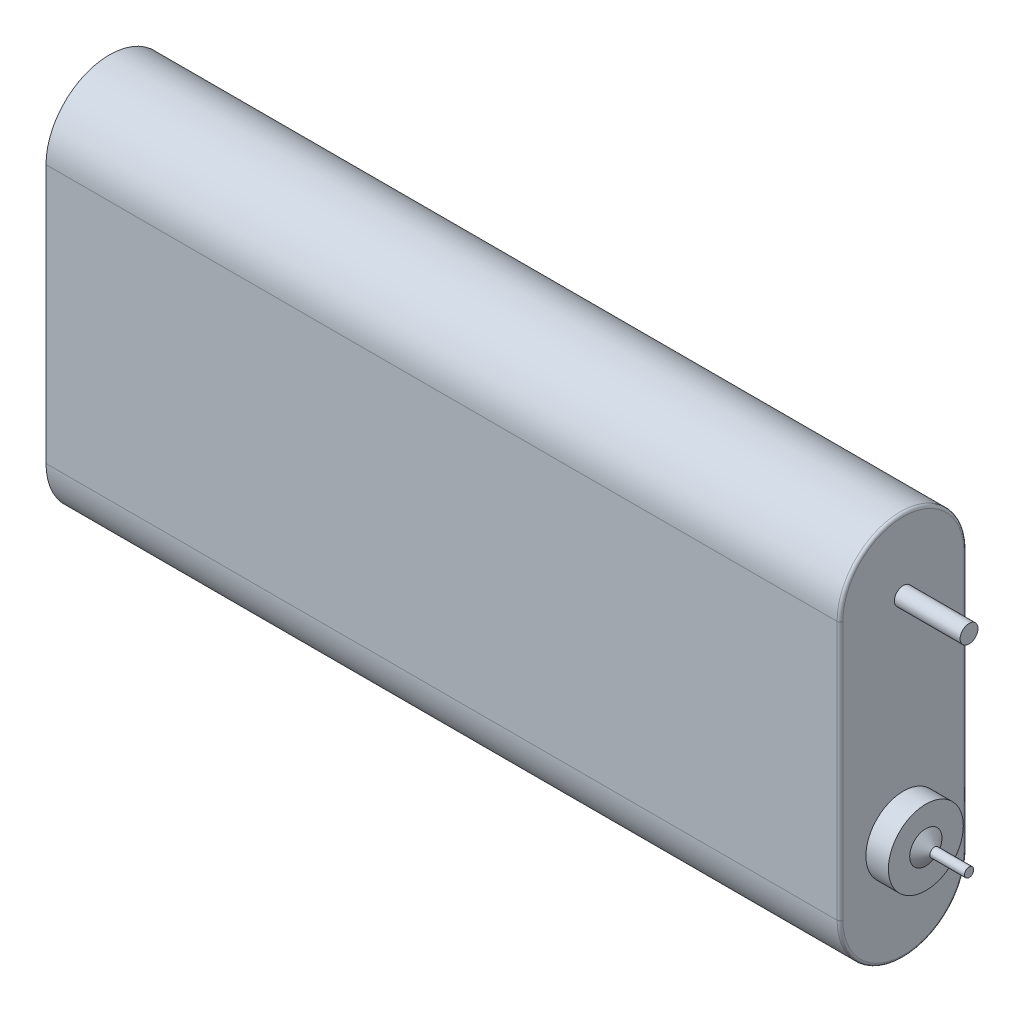
ISO-10303-21;
HEADER;
FILE_DESCRIPTION(('STEP AP214'),'2;1');
FILE_NAME('part.step','',(''),(''),'','','');
FILE_SCHEMA(('AUTOMOTIVE_DESIGN { 1 0 10303 214 1 1 1 1 }'));
ENDSEC;
DATA;
#1=APPLICATION_CONTEXT('core data for automotive mechanical design processes');
#2=APPLICATION_PROTOCOL_DEFINITION('international standard','automotive_design',2000,#1);
#3=PRODUCT_CONTEXT('',#1,'mechanical');
#4=PRODUCT('Part','Part','',(#3));
#5=PRODUCT_RELATED_PRODUCT_CATEGORY('part','',(#4));
#6=PRODUCT_DEFINITION_FORMATION('','',#4);
#7=PRODUCT_DEFINITION_CONTEXT('part definition',#1,'design');
#8=PRODUCT_DEFINITION('design','',#6,#7);
#9=PRODUCT_DEFINITION_SHAPE('','',#8);
#10=(LENGTH_UNIT() NAMED_UNIT(*) SI_UNIT(.MILLI.,.METRE.));
#11=(NAMED_UNIT(*) PLANE_ANGLE_UNIT() SI_UNIT($,.RADIAN.));
#12=(NAMED_UNIT(*) SI_UNIT($,.STERADIAN.) SOLID_ANGLE_UNIT());
#13=UNCERTAINTY_MEASURE_WITH_UNIT(LENGTH_MEASURE(1.E-05),#10,'distance_accuracy_value','');
#14=(GEOMETRIC_REPRESENTATION_CONTEXT(3) GLOBAL_UNCERTAINTY_ASSIGNED_CONTEXT((#13)) GLOBAL_UNIT_ASSIGNED_CONTEXT((#10,
#11,#12)) REPRESENTATION_CONTEXT('',''));
#15=CARTESIAN_POINT('',(0.,0.,0.));
#16=DIRECTION('',(0.,0.,1.));
#17=DIRECTION('',(1.,0.,0.));
#18=AXIS2_PLACEMENT_3D('',#15,#16,#17);
#19=CARTESIAN_POINT('',(34.9885,-5.70230000000002,0.));
#20=DIRECTION('',(-1.,0.,0.));
#21=DIRECTION('',(0.,0.,1.));
#22=AXIS2_PLACEMENT_3D('',#19,#20,#21);
#23=CYLINDRICAL_SURFACE('',#22,2.794);
#24=DIRECTION('',(-1.,0.,0.));
#25=VECTOR('',#24,1.);
#26=CARTESIAN_POINT('',(34.9885000000001,-5.70230000000002,-2.79399999999996));
#27=LINE('',#26,#25);
#28=CARTESIAN_POINT('',(34.8615000000001,-5.70230000000002,-2.79399999999996));
#29=VERTEX_POINT('',#28);
#30=CARTESIAN_POINT('',(0.,-5.70229999999999,-2.79399999999994));
#31=VERTEX_POINT('',#30);
#32=EDGE_CURVE('E145',#29,#31,#27,.T.);
#33=ORIENTED_EDGE('',*,*,#32,.F.);
#34=CARTESIAN_POINT('',(34.8615,-5.70230000000002,0.));
#35=DIRECTION('',(-1.,0.,0.));
#36=DIRECTION('',(0.,0.,1.));
#37=AXIS2_PLACEMENT_3D('',#34,#35,#36);
#38=CIRCLE('',#37,2.794);
#39=CARTESIAN_POINT('',(34.8615,-5.70230000000002,2.79400000000002));
#40=VERTEX_POINT('',#39);
#41=EDGE_CURVE('E112',#29,#40,#38,.T.);
#42=ORIENTED_EDGE('',*,*,#41,.T.);
#43=DIRECTION('',(-1.,0.,0.));
#44=VECTOR('',#43,1.);
#45=CARTESIAN_POINT('',(34.9885,-5.70230000000002,2.79400000000002));
#46=LINE('',#45,#44);
#47=CARTESIAN_POINT('',(0.,-5.70230000000002,2.79399999999999));
#48=VERTEX_POINT('',#47);
#49=EDGE_CURVE('E106',#40,#48,#46,.T.);
#50=ORIENTED_EDGE('',*,*,#49,.T.);
#51=CARTESIAN_POINT('',(0.,-5.70230000000002,0.));
#52=DIRECTION('',(-1.,0.,0.));
#53=DIRECTION('',(0.,0.,1.));
#54=AXIS2_PLACEMENT_3D('',#51,#52,#53);
#55=CIRCLE('',#54,2.794);
#56=EDGE_CURVE('E109',#31,#48,#55,.T.);
#57=ORIENTED_EDGE('',*,*,#56,.F.);
#58=EDGE_LOOP('',(#33,#42,#50,#57));
#59=FACE_BOUND('',#58,.T.);
#60=ADVANCED_FACE('F50',(#59),#23,.T.);
#61=CARTESIAN_POINT('',(34.9885000000001,5.70229999999997,-2.79399999999999));
#62=DIRECTION('',(0.,0.,-1.));
#63=DIRECTION('',(0.,1.,0.));
#64=AXIS2_PLACEMENT_3D('',#61,#62,#63);
#65=PLANE('',#64);
#66=DIRECTION('',(-1.,0.,0.));
#67=VECTOR('',#66,1.);
#68=CARTESIAN_POINT('',(34.9885000000001,5.70229999999997,-2.79399999999999));
#69=LINE('',#68,#67);
#70=CARTESIAN_POINT('',(34.8615000000001,5.70229999999997,-2.79399999999999));
#71=VERTEX_POINT('',#70);
#72=CARTESIAN_POINT('',(0.,5.70229999999999,-2.79399999999996));
#73=VERTEX_POINT('',#72);
#74=EDGE_CURVE('E149',#71,#73,#69,.T.);
#75=ORIENTED_EDGE('',*,*,#74,.F.);
#76=DIRECTION('',(0.,-1.,0.));
#77=VECTOR('',#76,1.);
#78=CARTESIAN_POINT('',(34.8615000000001,-5.70230000000002,-2.79399999999996));
#79=LINE('',#78,#77);
#80=EDGE_CURVE('E74',#71,#29,#79,.T.);
#81=ORIENTED_EDGE('',*,*,#80,.T.);
#82=ORIENTED_EDGE('',*,*,#32,.T.);
#83=DIRECTION('',(0.,-1.,0.));
#84=VECTOR('',#83,1.);
#85=CARTESIAN_POINT('',(0.,5.70229999999999,-2.79399999999996));
#86=LINE('',#85,#84);
#87=EDGE_CURVE('E118',#73,#31,#86,.T.);
#88=ORIENTED_EDGE('',*,*,#87,.F.);
#89=EDGE_LOOP('',(#75,#81,#82,#88));
#90=FACE_BOUND('',#89,.T.);
#91=ADVANCED_FACE('F208',(#90),#65,.T.);
#92=CARTESIAN_POINT('',(34.9885,5.70229999999997,0.));
#93=DIRECTION('',(-1.,0.,0.));
#94=DIRECTION('',(0.,0.,1.));
#95=AXIS2_PLACEMENT_3D('',#92,#93,#94);
#96=CYLINDRICAL_SURFACE('',#95,2.794);
#97=DIRECTION('',(-1.,0.,0.));
#98=VECTOR('',#97,1.);
#99=CARTESIAN_POINT('',(34.9885,5.70229999999997,2.79400000000003));
#100=LINE('',#99,#98);
#101=CARTESIAN_POINT('',(34.8615,5.70229999999997,2.79400000000003));
#102=VERTEX_POINT('',#101);
#103=CARTESIAN_POINT('',(0.,5.70229999999999,2.79399999999999));
#104=VERTEX_POINT('',#103);
#105=EDGE_CURVE('E117',#102,#104,#100,.T.);
#106=ORIENTED_EDGE('',*,*,#105,.F.);
#107=CARTESIAN_POINT('',(34.8615,5.70229999999997,0.));
#108=DIRECTION('',(-1.,0.,0.));
#109=DIRECTION('',(0.,0.,1.));
#110=AXIS2_PLACEMENT_3D('',#107,#108,#109);
#111=CIRCLE('',#110,2.794);
#112=EDGE_CURVE('E67',#102,#71,#111,.T.);
#113=ORIENTED_EDGE('',*,*,#112,.T.);
#114=ORIENTED_EDGE('',*,*,#74,.T.);
#115=CARTESIAN_POINT('',(0.,5.70229999999999,0.));
#116=DIRECTION('',(-1.,0.,0.));
#117=DIRECTION('',(0.,0.,1.));
#118=AXIS2_PLACEMENT_3D('',#115,#116,#117);
#119=CIRCLE('',#118,2.794);
#120=EDGE_CURVE('E127',#104,#73,#119,.T.);
#121=ORIENTED_EDGE('',*,*,#120,.F.);
#122=EDGE_LOOP('',(#106,#113,#114,#121));
#123=FACE_BOUND('',#122,.T.);
#124=ADVANCED_FACE('F213',(#123),#96,.T.);
#125=CARTESIAN_POINT('',(34.9885,-5.70230000000002,2.79400000000002));
#126=DIRECTION('',(0.,0.,1.));
#127=DIRECTION('',(0.,-1.,0.));
#128=AXIS2_PLACEMENT_3D('',#125,#126,#127);
#129=PLANE('',#128);
#130=ORIENTED_EDGE('',*,*,#49,.F.);
#131=DIRECTION('',(0.,1.,0.));
#132=VECTOR('',#131,1.);
#133=CARTESIAN_POINT('',(34.8615,5.70229999999997,2.79400000000003));
#134=LINE('',#133,#132);
#135=EDGE_CURVE('E148',#40,#102,#134,.T.);
#136=ORIENTED_EDGE('',*,*,#135,.T.);
#137=ORIENTED_EDGE('',*,*,#105,.T.);
#138=DIRECTION('',(0.,1.,0.));
#139=VECTOR('',#138,1.);
#140=CARTESIAN_POINT('',(0.,-5.70230000000002,2.79399999999999));
#141=LINE('',#140,#139);
#142=EDGE_CURVE('E121',#48,#104,#141,.T.);
#143=ORIENTED_EDGE('',*,*,#142,.F.);
#144=EDGE_LOOP('',(#130,#136,#137,#143));
#145=FACE_BOUND('',#144,.T.);
#146=ADVANCED_FACE('F122',(#145),#129,.T.);
#147=CARTESIAN_POINT('',(34.9885,-5.70230000000002,0.));
#148=DIRECTION('',(-1.,0.,0.));
#149=DIRECTION('',(0.,0.,1.));
#150=AXIS2_PLACEMENT_3D('',#147,#148,#149);
#151=PLANE('',#150);
#152=CARTESIAN_POINT('',(34.9885,5.70229999999997,0.));
#153=DIRECTION('',(-1.,0.,0.));
#154=DIRECTION('',(0.,0.,1.));
#155=AXIS2_PLACEMENT_3D('',#152,#153,#154);
#156=CIRCLE('',#155,2.667);
#157=CARTESIAN_POINT('',(34.9885000000001,5.70229999999997,-2.667));
#158=VERTEX_POINT('',#157);
#159=CARTESIAN_POINT('',(34.9885,5.70229999999997,2.66700000000004));
#160=VERTEX_POINT('',#159);
#161=EDGE_CURVE('E159',#158,#160,#156,.F.);
#162=ORIENTED_EDGE('',*,*,#161,.T.);
#163=DIRECTION('',(0.,1.,0.));
#164=VECTOR('',#163,1.);
#165=CARTESIAN_POINT('',(34.9885,-5.70230000000002,2.66700000000003));
#166=LINE('',#165,#164);
#167=CARTESIAN_POINT('',(34.9885,-5.70230000000002,2.66700000000003));
#168=VERTEX_POINT('',#167);
#169=EDGE_CURVE('E165',#160,#168,#166,.F.);
#170=ORIENTED_EDGE('',*,*,#169,.T.);
#171=CARTESIAN_POINT('',(34.9885,-5.70230000000002,0.));
#172=DIRECTION('',(-1.,0.,0.));
#173=DIRECTION('',(0.,0.,1.));
#174=AXIS2_PLACEMENT_3D('',#171,#172,#173);
#175=CIRCLE('',#174,2.667);
#176=CARTESIAN_POINT('',(34.9885000000001,-5.70230000000002,-2.66699999999997));
#177=VERTEX_POINT('',#176);
#178=EDGE_CURVE('E162',#168,#177,#175,.F.);
#179=ORIENTED_EDGE('',*,*,#178,.T.);
#180=DIRECTION('',(0.,-1.,0.));
#181=VECTOR('',#180,1.);
#182=CARTESIAN_POINT('',(34.9885000000001,5.70229999999997,-2.667));
#183=LINE('',#182,#181);
#184=EDGE_CURVE('E156',#177,#158,#183,.F.);
#185=ORIENTED_EDGE('',*,*,#184,.T.);
#186=EDGE_LOOP('',(#162,#170,#179,#185));
#187=FACE_BOUND('',#186,.T.);
#188=CARTESIAN_POINT('',(34.9885,-3.75920000000002,0.));
#189=DIRECTION('',(1.,0.,0.));
#190=DIRECTION('',(0.,0.,-1.));
#191=AXIS2_PLACEMENT_3D('',#188,#189,#190);
#192=CIRCLE('',#191,1.651);
#193=CARTESIAN_POINT('',(34.9885,-3.75920000000002,-1.65099999999996));
#194=VERTEX_POINT('',#193);
#195=EDGE_CURVE('E438',#194,#194,#192,.T.);
#196=ORIENTED_EDGE('',*,*,#195,.F.);
#197=EDGE_LOOP('',(#196));
#198=FACE_BOUND('',#197,.T.);
#199=CARTESIAN_POINT('',(34.9885,5.34669999999995,0.));
#200=DIRECTION('',(1.,0.,0.));
#201=DIRECTION('',(0.,0.,-1.));
#202=AXIS2_PLACEMENT_3D('',#199,#200,#201);
#203=CIRCLE('',#202,0.39370000000001);
#204=CARTESIAN_POINT('',(34.9885,5.34669999999995,-0.393699999999968));
#205=VERTEX_POINT('',#204);
#206=EDGE_CURVE('E132',#205,#205,#203,.T.);
#207=ORIENTED_EDGE('',*,*,#206,.F.);
#208=EDGE_LOOP('',(#207));
#209=FACE_BOUND('',#208,.T.);
#210=ADVANCED_FACE('F240',(#187,#198,#209),#151,.F.);
#211=CARTESIAN_POINT('',(0.,-5.70230000000002,0.));
#212=DIRECTION('',(-1.,0.,0.));
#213=DIRECTION('',(0.,0.,1.));
#214=AXIS2_PLACEMENT_3D('',#211,#212,#213);
#215=PLANE('',#214);
#216=ORIENTED_EDGE('',*,*,#56,.T.);
#217=ORIENTED_EDGE('',*,*,#142,.T.);
#218=ORIENTED_EDGE('',*,*,#120,.T.);
#219=ORIENTED_EDGE('',*,*,#87,.T.);
#220=EDGE_LOOP('',(#216,#217,#218,#219));
#221=FACE_BOUND('',#220,.T.);
#222=ADVANCED_FACE('F129',(#221),#215,.T.);
#223=CARTESIAN_POINT('',(34.9885,5.34669999999995,0.));
#224=DIRECTION('',(1.,0.,0.));
#225=DIRECTION('',(0.,0.,-1.));
#226=AXIS2_PLACEMENT_3D('',#223,#224,#225);
#227=CYLINDRICAL_SURFACE('',#226,0.39370000000001);
#228=ORIENTED_EDGE('',*,*,#206,.T.);
#229=EDGE_LOOP('',(#228));
#230=FACE_BOUND('',#229,.T.);
#231=CARTESIAN_POINT('',(37.8841,5.34669999999995,0.));
#232=DIRECTION('',(1.,0.,0.));
#233=DIRECTION('',(0.,0.,-1.));
#234=AXIS2_PLACEMENT_3D('',#231,#232,#233);
#235=CIRCLE('',#234,0.39370000000001);
#236=CARTESIAN_POINT('',(37.8841,5.34669999999995,-0.393699999999968));
#237=VERTEX_POINT('',#236);
#238=EDGE_CURVE('E137',#237,#237,#235,.T.);
#239=ORIENTED_EDGE('',*,*,#238,.F.);
#240=EDGE_LOOP('',(#239));
#241=FACE_BOUND('',#240,.T.);
#242=ADVANCED_FACE('F251',(#230,#241),#227,.T.);
#243=CARTESIAN_POINT('',(37.8841,5.34669999999995,0.));
#244=DIRECTION('',(1.,0.,0.));
#245=DIRECTION('',(0.,0.,-1.));
#246=AXIS2_PLACEMENT_3D('',#243,#244,#245);
#247=PLANE('',#246);
#248=ORIENTED_EDGE('',*,*,#238,.T.);
#249=EDGE_LOOP('',(#248));
#250=FACE_BOUND('',#249,.T.);
#251=ADVANCED_FACE('F256',(#250),#247,.T.);
#252=CARTESIAN_POINT('',(34.9885,-3.75920000000002,0.));
#253=DIRECTION('',(1.,0.,0.));
#254=DIRECTION('',(0.,0.,-1.));
#255=AXIS2_PLACEMENT_3D('',#252,#253,#254);
#256=CYLINDRICAL_SURFACE('',#255,1.651);
#257=ORIENTED_EDGE('',*,*,#195,.T.);
#258=EDGE_LOOP('',(#257));
#259=FACE_BOUND('',#258,.T.);
#260=CARTESIAN_POINT('',(35.9791000000006,-3.75920000000002,0.));
#261=DIRECTION('',(1.,0.,0.));
#262=DIRECTION('',(0.,0.,-1.));
#263=AXIS2_PLACEMENT_3D('',#260,#261,#262);
#264=CIRCLE('',#263,1.651);
#265=CARTESIAN_POINT('',(35.9791000000006,-3.75920000000002,-1.65099999999996));
#266=VERTEX_POINT('',#265);
#267=EDGE_CURVE('E188',#266,#266,#264,.T.);
#268=ORIENTED_EDGE('',*,*,#267,.F.);
#269=EDGE_LOOP('',(#268));
#270=FACE_BOUND('',#269,.T.);
#271=ADVANCED_FACE('F260',(#259,#270),#256,.T.);
#272=CARTESIAN_POINT('',(37.8841,-3.75920000000002,0.));
#273=DIRECTION('',(1.,0.,0.));
#274=DIRECTION('',(0.,0.,-1.));
#275=AXIS2_PLACEMENT_3D('',#272,#273,#274);
#276=PLANE('',#275);
#277=CARTESIAN_POINT('',(37.8841,-3.75920000000002,0.));
#278=DIRECTION('',(1.,0.,0.));
#279=DIRECTION('',(0.,0.,-1.));
#280=AXIS2_PLACEMENT_3D('',#277,#278,#279);
#281=CIRCLE('',#280,0.203200000000001);
#282=CARTESIAN_POINT('',(37.8841,-3.75920000000002,-0.203199999999959));
#283=VERTEX_POINT('',#282);
#284=EDGE_CURVE('E436',#283,#283,#281,.T.);
#285=ORIENTED_EDGE('',*,*,#284,.T.);
#286=EDGE_LOOP('',(#285));
#287=FACE_BOUND('',#286,.T.);
#288=ADVANCED_FACE('F264',(#287),#276,.T.);
#289=CARTESIAN_POINT('',(34.9885,-3.75920000000002,0.));
#290=DIRECTION('',(1.,0.,0.));
#291=DIRECTION('',(0.,0.,-1.));
#292=AXIS2_PLACEMENT_3D('',#289,#290,#291);
#293=CYLINDRICAL_SURFACE('',#292,0.2032);
#294=CARTESIAN_POINT('',(36.3601000000006,-3.75920000000002,0.));
#295=DIRECTION('',(1.,0.,0.));
#296=DIRECTION('',(0.,0.,-1.));
#297=AXIS2_PLACEMENT_3D('',#294,#295,#296);
#298=CIRCLE('',#297,0.2032);
#299=CARTESIAN_POINT('',(36.3601000000006,-3.75920000000002,0.203200000000047));
#300=VERTEX_POINT('',#299);
#301=EDGE_CURVE('E60',#300,#300,#298,.T.);
#302=ORIENTED_EDGE('',*,*,#301,.T.);
#303=EDGE_LOOP('',(#302));
#304=FACE_BOUND('',#303,.T.);
#305=ORIENTED_EDGE('',*,*,#284,.F.);
#306=EDGE_LOOP('',(#305));
#307=FACE_BOUND('',#306,.T.);
#308=ADVANCED_FACE('F194',(#304,#307),#293,.T.);
#309=CARTESIAN_POINT('',(35.9791000000006,-3.55600000000003,0.));
#310=DIRECTION('',(1.,0.,0.));
#311=DIRECTION('',(0.,0.,-1.));
#312=AXIS2_PLACEMENT_3D('',#309,#310,#311);
#313=PLANE('',#312);
#314=CARTESIAN_POINT('',(35.9791000000006,-3.75920000000002,0.));
#315=DIRECTION('',(1.,0.,0.));
#316=DIRECTION('',(0.,0.,-1.));
#317=AXIS2_PLACEMENT_3D('',#314,#315,#316);
#318=CIRCLE('',#317,0.711200000000002);
#319=CARTESIAN_POINT('',(35.9791000000006,-3.75920000000002,0.711200000000039));
#320=VERTEX_POINT('',#319);
#321=EDGE_CURVE('E11',#320,#320,#318,.F.);
#322=ORIENTED_EDGE('',*,*,#321,.T.);
#323=EDGE_LOOP('',(#322));
#324=FACE_BOUND('',#323,.T.);
#325=ORIENTED_EDGE('',*,*,#267,.T.);
#326=EDGE_LOOP('',(#325));
#327=FACE_BOUND('',#326,.T.);
#328=ADVANCED_FACE('F226',(#324,#327),#313,.T.);
#329=CARTESIAN_POINT('',(34.8615000000001,5.70229999999997,-2.667));
#330=DIRECTION('',(0.,1.,0.));
#331=DIRECTION('',(0.,0.,1.));
#332=AXIS2_PLACEMENT_3D('',#329,#330,#331);
#333=CYLINDRICAL_SURFACE('',#332,0.126999999999995);
#334=CARTESIAN_POINT('',(34.8615000000001,5.70229999999997,-2.667));
#335=DIRECTION('',(0.,1.,0.));
#336=DIRECTION('',(0.,0.,1.));
#337=AXIS2_PLACEMENT_3D('',#334,#335,#336);
#338=CIRCLE('',#337,0.126999999999995);
#339=EDGE_CURVE('E181',#158,#71,#338,.T.);
#340=ORIENTED_EDGE('',*,*,#339,.F.);
#341=ORIENTED_EDGE('',*,*,#184,.F.);
#342=CARTESIAN_POINT('',(34.8615000000001,-5.70230000000002,-2.66699999999997));
#343=DIRECTION('',(0.,-1.,0.));
#344=DIRECTION('',(0.,0.,-1.));
#345=AXIS2_PLACEMENT_3D('',#342,#343,#344);
#346=CIRCLE('',#345,0.126999999999995);
#347=EDGE_CURVE('E185',#29,#177,#346,.T.);
#348=ORIENTED_EDGE('',*,*,#347,.F.);
#349=ORIENTED_EDGE('',*,*,#80,.F.);
#350=EDGE_LOOP('',(#340,#341,#348,#349));
#351=FACE_BOUND('',#350,.T.);
#352=ADVANCED_FACE('F223',(#351),#333,.T.);
#353=CARTESIAN_POINT('',(34.8615,-5.70230000000002,0.));
#354=DIRECTION('',(-1.,0.,0.));
#355=DIRECTION('',(0.,0.,1.));
#356=AXIS2_PLACEMENT_3D('',#353,#354,#355);
#357=TOROIDAL_SURFACE('',#356,2.667,0.126999999999995);
#358=ORIENTED_EDGE('',*,*,#347,.T.);
#359=ORIENTED_EDGE('',*,*,#178,.F.);
#360=CARTESIAN_POINT('',(34.8615,-5.70230000000002,2.66700000000003));
#361=DIRECTION('',(0.,1.,0.));
#362=DIRECTION('',(0.,0.,1.));
#363=AXIS2_PLACEMENT_3D('',#360,#361,#362);
#364=CIRCLE('',#363,0.126999999999995);
#365=EDGE_CURVE('E178',#40,#168,#364,.T.);
#366=ORIENTED_EDGE('',*,*,#365,.F.);
#367=ORIENTED_EDGE('',*,*,#41,.F.);
#368=EDGE_LOOP('',(#358,#359,#366,#367));
#369=FACE_BOUND('',#368,.T.);
#370=ADVANCED_FACE('F220',(#369),#357,.T.);
#371=CARTESIAN_POINT('',(34.8615,5.70229999999997,0.));
#372=DIRECTION('',(-1.,0.,0.));
#373=DIRECTION('',(0.,0.,1.));
#374=AXIS2_PLACEMENT_3D('',#371,#372,#373);
#375=TOROIDAL_SURFACE('',#374,2.667,0.126999999999995);
#376=ORIENTED_EDGE('',*,*,#339,.T.);
#377=ORIENTED_EDGE('',*,*,#112,.F.);
#378=CARTESIAN_POINT('',(34.8615,5.70229999999997,2.66700000000004));
#379=DIRECTION('',(0.,-1.,0.));
#380=DIRECTION('',(0.,0.,-1.));
#381=AXIS2_PLACEMENT_3D('',#378,#379,#380);
#382=CIRCLE('',#381,0.126999999999995);
#383=EDGE_CURVE('E175',#160,#102,#382,.T.);
#384=ORIENTED_EDGE('',*,*,#383,.F.);
#385=ORIENTED_EDGE('',*,*,#161,.F.);
#386=EDGE_LOOP('',(#376,#377,#384,#385));
#387=FACE_BOUND('',#386,.T.);
#388=ADVANCED_FACE('F203',(#387),#375,.T.);
#389=CARTESIAN_POINT('',(34.8615,-5.70230000000002,2.66700000000003));
#390=DIRECTION('',(0.,-1.,0.));
#391=DIRECTION('',(0.,0.,-1.));
#392=AXIS2_PLACEMENT_3D('',#389,#390,#391);
#393=CYLINDRICAL_SURFACE('',#392,0.126999999999995);
#394=ORIENTED_EDGE('',*,*,#365,.T.);
#395=ORIENTED_EDGE('',*,*,#169,.F.);
#396=ORIENTED_EDGE('',*,*,#383,.T.);
#397=ORIENTED_EDGE('',*,*,#135,.F.);
#398=EDGE_LOOP('',(#394,#395,#396,#397));
#399=FACE_BOUND('',#398,.T.);
#400=ADVANCED_FACE('F198',(#399),#393,.T.);
#401=CARTESIAN_POINT('',(36.3601000000006,-3.75920000000002,0.));
#402=DIRECTION('',(-1.,0.,0.));
#403=DIRECTION('',(0.,0.,1.));
#404=AXIS2_PLACEMENT_3D('',#401,#402,#403);
#405=CONICAL_SURFACE('',#404,0.2032,0.927295218001615);
#406=CARTESIAN_POINT('',(35.9791000000006,-3.75920000000002,0.711200000000039));
#407=CARTESIAN_POINT('',(35.9830687500006,-3.75920000000002,0.705908333333373));
#408=CARTESIAN_POINT('',(35.9870375000006,-3.75920000000002,0.700616666666707));
#409=CARTESIAN_POINT('',(35.9949750000006,-3.75920000000002,0.690033333333373));
#410=CARTESIAN_POINT('',(35.9989437500006,-3.75920000000002,0.684741666666706));
#411=CARTESIAN_POINT('',(36.0068812500006,-3.75920000000002,0.674158333333373));
#412=CARTESIAN_POINT('',(36.0108500000006,-3.75920000000002,0.668866666666706));
#413=CARTESIAN_POINT('',(36.0187875000006,-3.75920000000002,0.658283333333373));
#414=CARTESIAN_POINT('',(36.0227562500006,-3.75920000000002,0.652991666666706));
#415=CARTESIAN_POINT('',(36.0306937500006,-3.75920000000002,0.642408333333373));
#416=CARTESIAN_POINT('',(36.0346625000006,-3.75920000000002,0.637116666666707));
#417=CARTESIAN_POINT('',(36.0426000000006,-3.75920000000002,0.626533333333374));
#418=CARTESIAN_POINT('',(36.0465687500006,-3.75920000000002,0.621241666666707));
#419=CARTESIAN_POINT('',(36.0545062500006,-3.75920000000002,0.610658333333374));
#420=CARTESIAN_POINT('',(36.0584750000006,-3.75920000000002,0.605366666666707));
#421=CARTESIAN_POINT('',(36.0664125000006,-3.75920000000002,0.594783333333374));
#422=CARTESIAN_POINT('',(36.0703812500006,-3.75920000000002,0.589491666666707));
#423=CARTESIAN_POINT('',(36.0783187500006,-3.75920000000002,0.578908333333374));
#424=CARTESIAN_POINT('',(36.0822875000006,-3.75920000000002,0.573616666666708));
#425=CARTESIAN_POINT('',(36.0902250000006,-3.75920000000002,0.563033333333375));
#426=CARTESIAN_POINT('',(36.0941937500006,-3.75920000000002,0.557741666666708));
#427=CARTESIAN_POINT('',(36.1021312500006,-3.75920000000002,0.547158333333374));
#428=CARTESIAN_POINT('',(36.1061000000006,-3.75920000000002,0.541866666666708));
#429=CARTESIAN_POINT('',(36.1140375000006,-3.75920000000002,0.531283333333375));
#430=CARTESIAN_POINT('',(36.1180062500006,-3.75920000000002,0.525991666666708));
#431=CARTESIAN_POINT('',(36.1259437500006,-3.75920000000002,0.515408333333375));
#432=CARTESIAN_POINT('',(36.1299125000006,-3.75920000000002,0.510116666666709));
#433=CARTESIAN_POINT('',(36.1378500000006,-3.75920000000002,0.499533333333375));
#434=CARTESIAN_POINT('',(36.1418187500006,-3.75920000000002,0.494241666666709));
#435=CARTESIAN_POINT('',(36.1497562500006,-3.75920000000002,0.483658333333376));
#436=CARTESIAN_POINT('',(36.1537250000006,-3.75920000000002,0.478366666666709));
#437=CARTESIAN_POINT('',(36.1616625000006,-3.75920000000002,0.467783333333376));
#438=CARTESIAN_POINT('',(36.1656312500006,-3.75920000000002,0.462491666666709));
#439=CARTESIAN_POINT('',(36.1735687500006,-3.75920000000002,0.451908333333376));
#440=CARTESIAN_POINT('',(36.1775375000006,-3.75920000000002,0.44661666666671));
#441=CARTESIAN_POINT('',(36.1854750000006,-3.75920000000002,0.436033333333377));
#442=CARTESIAN_POINT('',(36.1894437500006,-3.75920000000002,0.43074166666671));
#443=CARTESIAN_POINT('',(36.1973812500006,-3.75920000000002,0.420158333333376));
#444=CARTESIAN_POINT('',(36.2013500000006,-3.75920000000002,0.41486666666671));
#445=CARTESIAN_POINT('',(36.2092875000006,-3.75920000000002,0.404283333333377));
#446=CARTESIAN_POINT('',(36.2132562500006,-3.75920000000002,0.39899166666671));
#447=CARTESIAN_POINT('',(36.2211937500006,-3.75920000000002,0.388408333333377));
#448=CARTESIAN_POINT('',(36.2251625000006,-3.75920000000002,0.38311666666671));
#449=CARTESIAN_POINT('',(36.2331000000006,-3.75920000000002,0.372533333333377));
#450=CARTESIAN_POINT('',(36.2370687500006,-3.75920000000002,0.367241666666711));
#451=CARTESIAN_POINT('',(36.2450062500006,-3.75920000000002,0.356658333333378));
#452=CARTESIAN_POINT('',(36.2489750000006,-3.75920000000002,0.351366666666711));
#453=CARTESIAN_POINT('',(36.2569125000006,-3.75920000000002,0.340783333333378));
#454=CARTESIAN_POINT('',(36.2608812500006,-3.75920000000002,0.335491666666711));
#455=CARTESIAN_POINT('',(36.2688187500006,-3.75920000000002,0.324908333333378));
#456=CARTESIAN_POINT('',(36.2727875000006,-3.75920000000002,0.319616666666712));
#457=CARTESIAN_POINT('',(36.2807250000006,-3.75920000000002,0.309033333333379));
#458=CARTESIAN_POINT('',(36.2846937500006,-3.75920000000002,0.303741666666712));
#459=CARTESIAN_POINT('',(36.2926312500006,-3.75920000000002,0.293158333333378));
#460=CARTESIAN_POINT('',(36.2966000000006,-3.75920000000002,0.287866666666712));
#461=CARTESIAN_POINT('',(36.3045375000006,-3.75920000000002,0.277283333333379));
#462=CARTESIAN_POINT('',(36.3085062500006,-3.75920000000002,0.271991666666712));
#463=CARTESIAN_POINT('',(36.3164437500006,-3.75920000000002,0.261408333333379));
#464=CARTESIAN_POINT('',(36.3204125000006,-3.75920000000002,0.256116666666712));
#465=CARTESIAN_POINT('',(36.3283500000006,-3.75920000000002,0.245533333333379));
#466=CARTESIAN_POINT('',(36.3323187500006,-3.75920000000002,0.240241666666713));
#467=CARTESIAN_POINT('',(36.3402562500006,-3.75920000000002,0.22965833333338));
#468=CARTESIAN_POINT('',(36.3442250000006,-3.75920000000002,0.224366666666713));
#469=CARTESIAN_POINT('',(36.3521625000006,-3.75920000000002,0.21378333333338));
#470=CARTESIAN_POINT('',(36.3561312500006,-3.75920000000002,0.208491666666713));
#471=CARTESIAN_POINT('',(36.3601000000006,-3.75920000000002,0.203200000000047));
#472=B_SPLINE_CURVE_WITH_KNOTS('',3,(#406,#407,#408,#409,#410,#411,#412,#413,#414,#415,#416,
#417,#418,#419,#420,#421,#422,#423,#424,#425,#426,#427,#428,#429,#430,#431,#432,#433,#434,#435,
#436,#437,#438,#439,#440,#441,#442,#443,#444,#445,#446,#447,#448,#449,#450,#451,#452,#453,#454,
#455,#456,#457,#458,#459,#460,#461,#462,#463,#464,#465,#466,#467,#468,#469,#470,#471),
.UNSPECIFIED.,.F.,.F.,(4,2,2,2,2,2,2,2,2,2,2,2,2,2,2,2,2,2,2,2,2,2,2,2,2,2,2,2,2,2,2,2,4),(0.,
0.0198437500000034,0.0396875000000025,0.0595312500000017,0.0793750000000008,0.0992187499999999,
0.119062499999999,0.138906249999998,0.158749999999997,0.178593750000001,0.1984375,
0.218281249999999,0.238124999999998,0.257968749999997,0.277812499999996,0.297656249999996,
0.317499999999995,0.337343749999998,0.357187499999997,0.377031249999996,0.396874999999995,
0.416718749999995,0.436562499999994,0.456406249999993,0.476249999999992,0.496093749999995,
0.515937499999994,0.535781249999994,0.555624999999993,0.575468749999992,0.595312499999991,
0.61515624999999,0.634999999999989),.UNSPECIFIED.);
#473=EDGE_CURVE('BSEAM53',#320,#300,#472,.T.);
#474=ORIENTED_EDGE('',*,*,#321,.F.);
#475=ORIENTED_EDGE('',*,*,#301,.F.);
#476=ORIENTED_EDGE('',*,*,#473,.T.);
#477=ORIENTED_EDGE('',*,*,#473,.F.);
#478=EDGE_LOOP('',(#474,#476,#475,#477));
#479=FACE_BOUND('',#478,.T.);
#480=ADVANCED_FACE('F53',(#479),#405,.T.);
#481=CLOSED_SHELL('',(#60,#91,#124,#146,#210,#222,#242,#251,#271,#288,#308,#328,#352,#370,#388,
#400,#480));
#482=MANIFOLD_SOLID_BREP('B2',#481);
#483=ADVANCED_BREP_SHAPE_REPRESENTATION('',(#18,#482),#14);
#484=SHAPE_DEFINITION_REPRESENTATION(#9,#483);
ENDSEC;
END-ISO-10303-21;
